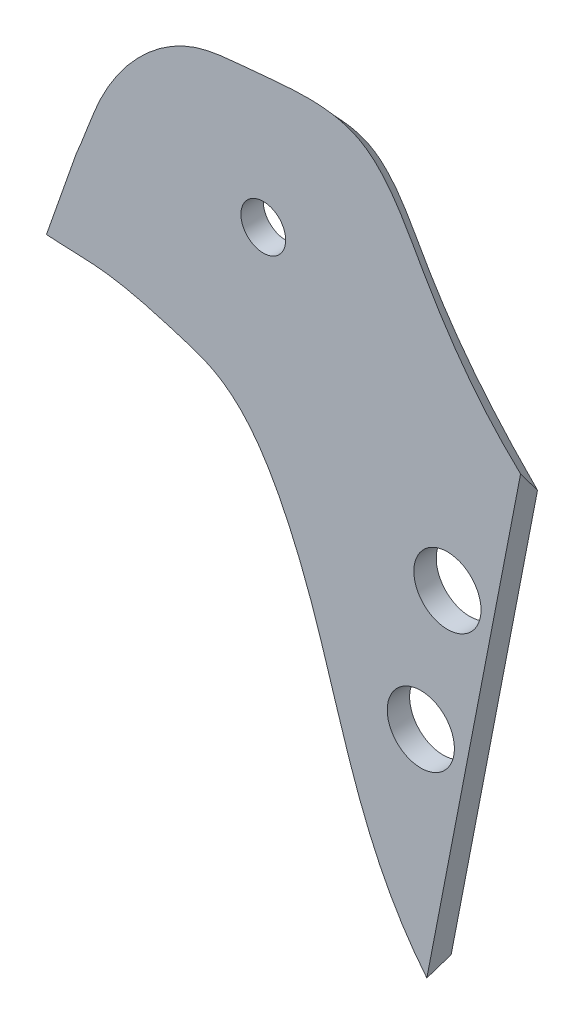
ISO-10303-21;
HEADER;
FILE_DESCRIPTION(('STEP AP214'),'2;1');
FILE_NAME('part.step','',(''),(''),'','','');
FILE_SCHEMA(('AUTOMOTIVE_DESIGN { 1 0 10303 214 1 1 1 1 }'));
ENDSEC;
DATA;
#1=APPLICATION_CONTEXT('core data for automotive mechanical design processes');
#2=APPLICATION_PROTOCOL_DEFINITION('international standard','automotive_design',2000,#1);
#3=PRODUCT_CONTEXT('',#1,'mechanical');
#4=PRODUCT('Part','Part','',(#3));
#5=PRODUCT_RELATED_PRODUCT_CATEGORY('part','',(#4));
#6=PRODUCT_DEFINITION_FORMATION('','',#4);
#7=PRODUCT_DEFINITION_CONTEXT('part definition',#1,'design');
#8=PRODUCT_DEFINITION('design','',#6,#7);
#9=PRODUCT_DEFINITION_SHAPE('','',#8);
#10=(LENGTH_UNIT() NAMED_UNIT(*) SI_UNIT(.MILLI.,.METRE.));
#11=(NAMED_UNIT(*) PLANE_ANGLE_UNIT() SI_UNIT($,.RADIAN.));
#12=(NAMED_UNIT(*) SI_UNIT($,.STERADIAN.) SOLID_ANGLE_UNIT());
#13=UNCERTAINTY_MEASURE_WITH_UNIT(LENGTH_MEASURE(1.E-05),#10,'distance_accuracy_value','');
#14=(GEOMETRIC_REPRESENTATION_CONTEXT(3) GLOBAL_UNCERTAINTY_ASSIGNED_CONTEXT((#13)) GLOBAL_UNIT_ASSIGNED_CONTEXT((#10,
#11,#12)) REPRESENTATION_CONTEXT('',''));
#15=CARTESIAN_POINT('',(0.,0.,0.));
#16=DIRECTION('',(0.,0.,1.));
#17=DIRECTION('',(1.,0.,0.));
#18=AXIS2_PLACEMENT_3D('',#15,#16,#17);
#19=CARTESIAN_POINT('',(0.,0.,16.01702912884));
#20=DIRECTION('',(0.,0.,-1.));
#21=DIRECTION('',(-1.,0.,0.));
#22=AXIS2_PLACEMENT_3D('',#19,#20,#21);
#23=PLANE('',#22);
#24=CARTESIAN_POINT('',(51.1823021652925,-0.288224536730692,16.01702912884));
#25=DIRECTION('',(0.,0.,-1.));
#26=DIRECTION('',(-1.,0.,0.));
#27=AXIS2_PLACEMENT_3D('',#24,#25,#26);
#28=CIRCLE('',#27,2.55);
#29=CARTESIAN_POINT('',(48.6323021652925,-0.288224536730692,16.01702912884));
#30=VERTEX_POINT('',#29);
#31=EDGE_CURVE('E217',#30,#30,#28,.F.);
#32=ORIENTED_EDGE('',*,*,#31,.F.);
#33=EDGE_LOOP('',(#32));
#34=FACE_BOUND('',#33,.T.);
#35=CARTESIAN_POINT('',(56.7374791845424,10.1611521460587,16.01702912884));
#36=CARTESIAN_POINT('',(53.6201790954461,13.0770034793296,16.01702912884));
#37=CARTESIAN_POINT('',(50.0180932993099,18.1127380968674,16.01702912884));
#38=CARTESIAN_POINT('',(45.1972513004322,27.6593441288069,16.01702912884));
#39=CARTESIAN_POINT('',(37.5823057666446,26.5396477813974,16.01702912884));
#40=CARTESIAN_POINT('',(30.2888783292712,26.1262149818505,16.01702912884));
#41=CARTESIAN_POINT('',(25.1507624600812,20.7991546822461,16.01702912884));
#42=CARTESIAN_POINT('',(23.7062806262853,15.9520347530322,16.01702912884));
#43=CARTESIAN_POINT('',(22.9879280203535,14.3317152162057,16.01702912884));
#44=B_SPLINE_CURVE_WITH_KNOTS('',3,(#35,#36,#37,#38,#39,#40,#41,#42,#43),.UNSPECIFIED.,.F.,.F.,
(4,1,1,1,1,1,4),(0.0984022232735256,0.332263847237948,0.478784406260262,0.635689441844704,
0.712428507943073,0.897170220945366,1.),.UNSPECIFIED.);
#45=CARTESIAN_POINT('',(56.7374791845424,10.1611521460587,16.01702912884));
#46=VERTEX_POINT('',#45);
#47=CARTESIAN_POINT('',(22.9879280203535,14.3317152162057,16.01702912884));
#48=VERTEX_POINT('',#47);
#49=EDGE_CURVE('E11',#46,#48,#44,.T.);
#50=ORIENTED_EDGE('',*,*,#49,.T.);
#51=DIRECTION('',(-0.330896267797108,-0.943667134088045,0.));
#52=VECTOR('',#51,1.);
#53=CARTESIAN_POINT('',(22.9879280203535,14.3317152162057,16.01702912884));
#54=LINE('',#53,#52);
#55=CARTESIAN_POINT('',(20.7358239624741,7.90904808817925,16.01702912884));
#56=VERTEX_POINT('',#55);
#57=EDGE_CURVE('E56',#48,#56,#54,.T.);
#58=ORIENTED_EDGE('',*,*,#57,.T.);
#59=CARTESIAN_POINT('',(49.6196669779243,-26.5463761324561,16.01702912884));
#60=CARTESIAN_POINT('',(43.2492805940054,-18.7500409121456,16.01702912884));
#61=CARTESIAN_POINT('',(42.939430023337,-9.06895658906215,16.01702912884));
#62=CARTESIAN_POINT('',(37.1332559765229,1.93741252860381,16.01702912884));
#63=CARTESIAN_POINT('',(35.2507090670857,4.55315707015074,16.01702912884));
#64=CARTESIAN_POINT('',(32.1310659942215,5.91401084382313,16.01702912884));
#65=CARTESIAN_POINT('',(30.4318693935687,6.42225490504846,16.01702912884));
#66=CARTESIAN_POINT('',(28.0514115307685,7.1211363639849,16.01702912884));
#67=CARTESIAN_POINT('',(25.7237718116332,7.64883772411055,16.01702912884));
#68=CARTESIAN_POINT('',(23.0704306063669,7.80734939259081,16.01702912884));
#69=CARTESIAN_POINT('',(21.6154249352378,7.83542911899976,16.01702912884));
#70=CARTESIAN_POINT('',(20.7358239624741,7.90904808817925,16.01702912884));
#71=B_SPLINE_CURVE_WITH_KNOTS('',3,(#59,#60,#61,#62,#63,#64,#65,#66,#67,#68,#69,#70),
.UNSPECIFIED.,.F.,.F.,(4,1,1,1,1,1,1,1,1,4),(0.,0.5753955187474,0.590281858038789,
0.73120017124348,0.761280417756446,0.79948376879211,0.83778666902761,0.91153847834065,
0.945817570362568,1.),.UNSPECIFIED.);
#72=CARTESIAN_POINT('',(49.6196669779243,-26.5463761324561,16.01702912884));
#73=VERTEX_POINT('',#72);
#74=EDGE_CURVE('E48',#56,#73,#71,.F.);
#75=ORIENTED_EDGE('',*,*,#74,.T.);
#76=DIRECTION('',(-0.190360349727867,-0.981714284938079,0.));
#77=VECTOR('',#76,1.);
#78=CARTESIAN_POINT('',(54.4053665233455,-1.86587090183388,16.01702912884));
#79=LINE('',#78,#77);
#80=EDGE_CURVE('E62',#46,#73,#79,.T.);
#81=ORIENTED_EDGE('',*,*,#80,.F.);
#82=EDGE_LOOP('',(#50,#58,#75,#81));
#83=FACE_BOUND('',#82,.T.);
#84=CARTESIAN_POINT('',(49.1635521652925,-10.4166543376605,16.01702912884));
#85=DIRECTION('',(0.,0.,-1.));
#86=DIRECTION('',(-1.,0.,0.));
#87=AXIS2_PLACEMENT_3D('',#84,#85,#86);
#88=CIRCLE('',#87,2.54999999999999);
#89=CARTESIAN_POINT('',(46.6135521652925,-10.4166543376605,16.01702912884));
#90=VERTEX_POINT('',#89);
#91=EDGE_CURVE('E102',#90,#90,#88,.F.);
#92=ORIENTED_EDGE('',*,*,#91,.F.);
#93=EDGE_LOOP('',(#92));
#94=FACE_BOUND('',#93,.T.);
#95=CARTESIAN_POINT('',(37.1997621715917,16.6182196540824,16.01702912884));
#96=DIRECTION('',(0.,0.,-1.));
#97=DIRECTION('',(-1.,0.,0.));
#98=AXIS2_PLACEMENT_3D('',#95,#96,#97);
#99=CIRCLE('',#98,1.7);
#100=CARTESIAN_POINT('',(35.4997621715917,16.6182196540824,16.01702912884));
#101=VERTEX_POINT('',#100);
#102=EDGE_CURVE('E203',#101,#101,#99,.F.);
#103=ORIENTED_EDGE('',*,*,#102,.F.);
#104=EDGE_LOOP('',(#103));
#105=FACE_BOUND('',#104,.T.);
#106=ADVANCED_FACE('F37',(#34,#83,#94,#105),#23,.F.);
#107=CARTESIAN_POINT('',(54.4053665233455,-1.86587090183388,9.68452912884005));
#108=DIRECTION('',(-0.981714284938079,0.190360349727867,0.));
#109=DIRECTION('',(-0.190360349727867,-0.981714284938079,0.));
#110=AXIS2_PLACEMENT_3D('',#107,#108,#109);
#111=PLANE('',#110);
#112=DIRECTION('',(0.149801028702046,0.772544334917706,0.617037196922818));
#113=VECTOR('',#112,1.);
#114=CARTESIAN_POINT('',(56.5311206780671,9.09693318494118,15.16702912884));
#115=LINE('',#114,#113);
#116=CARTESIAN_POINT('',(56.3247621715917,8.03271422382369,14.31702912884));
#117=VERTEX_POINT('',#116);
#118=EDGE_CURVE('E90',#117,#46,#115,.T.);
#119=ORIENTED_EDGE('',*,*,#118,.T.);
#120=ORIENTED_EDGE('',*,*,#80,.T.);
#121=DIRECTION('',(0.0787333022099367,0.40603837716383,-0.910458073385745));
#122=VECTOR('',#121,1.);
#123=CARTESIAN_POINT('',(49.6931720725956,-26.1673003345934,15.16702912884));
#124=LINE('',#123,#122);
#125=CARTESIAN_POINT('',(49.7666771672669,-25.7882245367307,14.31702912884));
#126=VERTEX_POINT('',#125);
#127=EDGE_CURVE('E111',#73,#126,#124,.T.);
#128=ORIENTED_EDGE('',*,*,#127,.T.);
#129=DIRECTION('',(0.190360349727867,0.981714284938079,0.));
#130=VECTOR('',#129,1.);
#131=CARTESIAN_POINT('',(49.7666771672668,-25.7882245367307,14.31702912884));
#132=LINE('',#131,#130);
#133=EDGE_CURVE('E110',#126,#117,#132,.T.);
#134=ORIENTED_EDGE('',*,*,#133,.T.);
#135=EDGE_LOOP('',(#119,#120,#128,#134));
#136=FACE_BOUND('',#135,.T.);
#137=ADVANCED_FACE('F274',(#136),#111,.F.);
#138=CARTESIAN_POINT('',(37.1997621715917,16.6182196540824,15.59202912884));
#139=DIRECTION('',(0.,0.,1.));
#140=DIRECTION('',(1.,0.,0.));
#141=AXIS2_PLACEMENT_3D('',#138,#139,#140);
#142=CYLINDRICAL_SURFACE('',#141,1.7);
#143=ORIENTED_EDGE('',*,*,#102,.T.);
#144=EDGE_LOOP('',(#143));
#145=FACE_BOUND('',#144,.T.);
#146=CARTESIAN_POINT('',(37.1997621715917,16.6182196540824,14.31702912884));
#147=DIRECTION('',(0.,0.,1.));
#148=DIRECTION('',(1.,0.,0.));
#149=AXIS2_PLACEMENT_3D('',#146,#147,#148);
#150=CIRCLE('',#149,1.7);
#151=CARTESIAN_POINT('',(38.8997621715917,16.6182196540824,14.31702912884));
#152=VERTEX_POINT('',#151);
#153=EDGE_CURVE('E248',#152,#152,#150,.T.);
#154=ORIENTED_EDGE('',*,*,#153,.F.);
#155=EDGE_LOOP('',(#154));
#156=FACE_BOUND('',#155,.T.);
#157=ADVANCED_FACE('F271',(#145,#156),#142,.F.);
#158=CARTESIAN_POINT('',(51.1823021652925,-0.288224536730692,4.55453996073724));
#159=DIRECTION('',(0.,0.,1.));
#160=DIRECTION('',(1.,0.,0.));
#161=AXIS2_PLACEMENT_3D('',#158,#159,#160);
#162=CYLINDRICAL_SURFACE('',#161,2.55);
#163=ORIENTED_EDGE('',*,*,#31,.T.);
#164=EDGE_LOOP('',(#163));
#165=FACE_BOUND('',#164,.T.);
#166=CARTESIAN_POINT('',(51.1823021652925,-0.288224536730692,14.31702912884));
#167=DIRECTION('',(0.,0.,1.));
#168=DIRECTION('',(1.,0.,0.));
#169=AXIS2_PLACEMENT_3D('',#166,#167,#168);
#170=CIRCLE('',#169,2.55);
#171=CARTESIAN_POINT('',(53.7323021652925,-0.288224536730692,14.31702912884));
#172=VERTEX_POINT('',#171);
#173=EDGE_CURVE('E251',#172,#172,#170,.T.);
#174=ORIENTED_EDGE('',*,*,#173,.F.);
#175=EDGE_LOOP('',(#174));
#176=FACE_BOUND('',#175,.T.);
#177=ADVANCED_FACE('F266',(#165,#176),#162,.F.);
#178=CARTESIAN_POINT('',(49.1635521652925,-10.4166543376605,4.55453996073728));
#179=DIRECTION('',(0.,0.,1.));
#180=DIRECTION('',(1.,0.,0.));
#181=AXIS2_PLACEMENT_3D('',#178,#179,#180);
#182=CYLINDRICAL_SURFACE('',#181,2.54999999999999);
#183=ORIENTED_EDGE('',*,*,#91,.T.);
#184=EDGE_LOOP('',(#183));
#185=FACE_BOUND('',#184,.T.);
#186=CARTESIAN_POINT('',(49.1635521652925,-10.4166543376605,14.31702912884));
#187=DIRECTION('',(0.,0.,1.));
#188=DIRECTION('',(1.,0.,0.));
#189=AXIS2_PLACEMENT_3D('',#186,#187,#188);
#190=CIRCLE('',#189,2.54999999999999);
#191=CARTESIAN_POINT('',(51.7135521652925,-10.4166543376605,14.31702912884));
#192=VERTEX_POINT('',#191);
#193=EDGE_CURVE('E256',#192,#192,#190,.T.);
#194=ORIENTED_EDGE('',*,*,#193,.F.);
#195=EDGE_LOOP('',(#194));
#196=FACE_BOUND('',#195,.T.);
#197=ADVANCED_FACE('F180',(#185,#196),#182,.F.);
#198=CARTESIAN_POINT('',(42.2011849808601,24.8148172093596,14.31702912884));
#199=DIRECTION('',(0.,0.,-1.));
#200=DIRECTION('',(1.,0.,0.));
#201=AXIS2_PLACEMENT_3D('',#198,#199,#200);
#202=PLANE('',#201);
#203=ORIENTED_EDGE('',*,*,#193,.T.);
#204=EDGE_LOOP('',(#203));
#205=FACE_BOUND('',#204,.T.);
#206=ORIENTED_EDGE('',*,*,#173,.T.);
#207=EDGE_LOOP('',(#206));
#208=FACE_BOUND('',#207,.T.);
#209=ORIENTED_EDGE('',*,*,#153,.T.);
#210=EDGE_LOOP('',(#209));
#211=FACE_BOUND('',#210,.T.);
#212=CARTESIAN_POINT('',(56.3247621715917,8.03271422382369,14.31702912884));
#213=CARTESIAN_POINT('',(52.8679076907351,11.496165528097,14.31702912884));
#214=CARTESIAN_POINT('',(48.8599680154124,16.3360273622185,14.31702912884));
#215=CARTESIAN_POINT('',(44.2241470254929,25.775486125325,14.31702912884));
#216=CARTESIAN_POINT('',(37.567466531524,24.6409319402532,14.31702912884));
#217=CARTESIAN_POINT('',(29.7072493366158,23.9216854788249,14.31702912884));
#218=CARTESIAN_POINT('',(25.7295651741228,18.0078595906483,14.31702912884));
#219=CARTESIAN_POINT('',(24.7497084623282,14.0682196540823,14.31702912884));
#220=B_SPLINE_CURVE_WITH_KNOTS('',3,(#212,#213,#214,#215,#216,#217,#218,#219),.UNSPECIFIED.,.F.,
.F.,(4,1,1,1,1,4),(0.,0.315366468989364,0.46461990204709,0.621804756140367,0.707276749613521,
1.),.UNSPECIFIED.);
#221=CARTESIAN_POINT('',(24.7497084623282,14.0682196540823,14.31702912884));
#222=VERTEX_POINT('',#221);
#223=EDGE_CURVE('E97',#117,#222,#220,.T.);
#224=ORIENTED_EDGE('',*,*,#223,.F.);
#225=ORIENTED_EDGE('',*,*,#133,.F.);
#226=CARTESIAN_POINT('',(23.0872300498878,9.14472589416278,14.31702912884));
#227=CARTESIAN_POINT('',(23.9071552614502,8.90389135487674,14.31702912884));
#228=CARTESIAN_POINT('',(26.4147155565695,8.40600553783021,14.31702912884));
#229=CARTESIAN_POINT('',(30.1574904202226,7.93532093414824,14.31702912884));
#230=CARTESIAN_POINT('',(35.409397744306,5.68865065157843,14.31702912884));
#231=CARTESIAN_POINT('',(43.4811194703326,-5.64116995348703,14.31702912884));
#232=CARTESIAN_POINT('',(43.5281504977051,-18.220731086188,14.31702912884));
#233=CARTESIAN_POINT('',(49.7666771672669,-25.7882245367307,14.31702912884));
#234=B_SPLINE_CURVE_WITH_KNOTS('',3,(#226,#227,#228,#229,#230,#231,#232,#233),.UNSPECIFIED.,.F.,
.F.,(4,1,1,1,1,4),(0.,0.0541824296374315,0.16221333097239,0.238719582243554,0.409718141961211,
1.),.UNSPECIFIED.);
#235=CARTESIAN_POINT('',(23.0872300498878,9.14472589416278,14.31702912884));
#236=VERTEX_POINT('',#235);
#237=EDGE_CURVE('E100',#236,#126,#234,.T.);
#238=ORIENTED_EDGE('',*,*,#237,.F.);
#239=DIRECTION('',(-0.319916718913096,-0.947445667550324,0.));
#240=VECTOR('',#239,1.);
#241=CARTESIAN_POINT('',(24.7497084623282,14.0682196540823,14.31702912884));
#242=LINE('',#241,#240);
#243=EDGE_CURVE('E84',#222,#236,#242,.T.);
#244=ORIENTED_EDGE('',*,*,#243,.F.);
#245=EDGE_LOOP('',(#224,#225,#238,#244));
#246=FACE_BOUND('',#245,.T.);
#247=ADVANCED_FACE('F95',(#205,#208,#211,#246),#202,.T.);
#248=CARTESIAN_POINT('',(56.7374791845424,10.1611521460587,16.01702912884));
#249=CARTESIAN_POINT('',(56.3247621715917,8.03271422382369,14.31702912884));
#250=CARTESIAN_POINT('',(53.6201790954461,13.0770034793296,16.01702912884));
#251=CARTESIAN_POINT('',(53.4815340141107,10.8813682024356,14.31702912884));
#252=CARTESIAN_POINT('',(50.9276386605399,16.8411889664497,16.01702912884));
#253=CARTESIAN_POINT('',(50.6303744477103,14.1981402639373,14.31702912884));
#254=CARTESIAN_POINT('',(47.4668919484403,23.1648253070632,16.01702912884));
#255=CARTESIAN_POINT('',(47.2667425586454,19.7150457705081,14.31702912884));
#256=CARTESIAN_POINT('',(45.4662591057677,25.8150722220901,16.01702912884));
#257=CARTESIAN_POINT('',(45.7145385390748,22.7407509049763,14.31702912884));
#258=CARTESIAN_POINT('',(41.4908067982299,27.1143510815713,16.01702912884));
#259=CARTESIAN_POINT('',(42.6933411886686,25.2368619241954,14.31702912884));
#260=CARTESIAN_POINT('',(37.9577758668488,26.6416571868208,16.01702912884));
#261=CARTESIAN_POINT('',(39.4587516791819,24.9632796151015,14.31702912884));
#262=CARTESIAN_POINT('',(34.4403844972373,26.3615458783455,16.01702912884));
#263=CARTESIAN_POINT('',(36.052554326043,24.5184502229449,14.31702912884));
#264=CARTESIAN_POINT('',(32.7201382629059,26.1402152904171,16.01702912884));
#265=CARTESIAN_POINT('',(34.3900462403712,24.3501831932131,14.31702912884));
#266=CARTESIAN_POINT('',(28.8729837341728,24.6582535582475,16.01702912884));
#267=CARTESIAN_POINT('',(30.6843016318662,23.4039560479854,14.31702912884));
#268=CARTESIAN_POINT('',(25.0319533013774,20.400477296728,16.01702912884));
#269=CARTESIAN_POINT('',(26.9291205566539,19.7912997497251,14.31702912884));
#270=CARTESIAN_POINT('',(23.7062806262853,15.9520347530322,16.01702912884));
#271=CARTESIAN_POINT('',(25.1314869237919,15.6032090618174,14.31702912884));
#272=CARTESIAN_POINT('',(22.9879280203535,14.3317152162057,16.01702912884));
#273=CARTESIAN_POINT('',(24.7497084623282,14.0682196540823,14.31702912884));
#274=B_SPLINE_SURFACE_WITH_KNOTS('',3,1,((#248,#249),(#250,#251),(#252,#253),(#254,#255),(#256,
#257),(#258,#259),(#260,#261),(#262,#263),(#264,#265),(#266,#267),(#268,#269),(#270,#271),(#272,
#273)),.UNSPECIFIED.,.F.,.F.,.F.,(4,1,1,1,1,1,1,1,1,1,4),(2,2),(0.,0.259385759372132,
0.315366468989364,0.421897871540711,0.46461990204709,0.595927843258402,0.621804756140367,
0.681042367805029,0.707276749613521,0.88594716878297,1.),(0.,1.),.UNSPECIFIED.);
#275=DIRECTION('',(0.715479586900087,-0.107008621191608,-0.69038982880685));
#276=VECTOR('',#275,1.);
#277=CARTESIAN_POINT('',(23.8688182413409,14.199967435144,15.16702912884));
#278=LINE('',#277,#276);
#279=EDGE_CURVE('E81',#48,#222,#278,.T.);
#280=ORIENTED_EDGE('',*,*,#49,.F.);
#281=ORIENTED_EDGE('',*,*,#118,.F.);
#282=ORIENTED_EDGE('',*,*,#223,.T.);
#283=ORIENTED_EDGE('',*,*,#279,.F.);
#284=EDGE_LOOP('',(#280,#281,#282,#283));
#285=FACE_BOUND('',#284,.T.);
#286=ADVANCED_FACE('F107',(#285),#274,.F.);
#287=CARTESIAN_POINT('',(22.9879280203535,14.3317152162057,16.01702912884));
#288=CARTESIAN_POINT('',(24.7497084623282,14.0682196540823,14.31702912884));
#289=CARTESIAN_POINT('',(22.6125773440403,13.261270694868,16.01702912884));
#290=CARTESIAN_POINT('',(24.4726287269215,13.2476373607624,14.31702912884));
#291=CARTESIAN_POINT('',(22.2372266677271,12.1908261735302,16.01702912884));
#292=CARTESIAN_POINT('',(24.1955489915148,12.4270550674425,14.31702912884));
#293=CARTESIAN_POINT('',(21.4865253151006,10.0499371308547,16.01702912884));
#294=CARTESIAN_POINT('',(23.6413895207013,10.7858904808026,14.31702912884));
#295=CARTESIAN_POINT('',(21.1111746387874,8.97949260951699,16.01702912884));
#296=CARTESIAN_POINT('',(23.3643097852946,9.96530818748272,14.31702912884));
#297=CARTESIAN_POINT('',(20.7358239624741,7.90904808817925,16.01702912884));
#298=CARTESIAN_POINT('',(23.0872300498878,9.14472589416278,14.31702912884));
#299=B_SPLINE_SURFACE_WITH_KNOTS('',3,1,((#287,#288),(#289,#290),(#291,#292),(#293,#294),(#295,
#296),(#297,#298)),.UNSPECIFIED.,.F.,.F.,.F.,(4,2,4),(2,2),(0.,0.5,1.),(0.,1.),.UNSPECIFIED.);
#300=DIRECTION('',(0.745595344172381,0.391814763077272,-0.539044315602316));
#301=VECTOR('',#300,1.);
#302=CARTESIAN_POINT('',(21.911527006181,8.52688699117102,15.16702912884));
#303=LINE('',#302,#301);
#304=EDGE_CURVE('E89',#56,#236,#303,.T.);
#305=ORIENTED_EDGE('',*,*,#57,.F.);
#306=ORIENTED_EDGE('',*,*,#279,.T.);
#307=ORIENTED_EDGE('',*,*,#243,.T.);
#308=ORIENTED_EDGE('',*,*,#304,.F.);
#309=EDGE_LOOP('',(#305,#306,#307,#308));
#310=FACE_BOUND('',#309,.T.);
#311=ADVANCED_FACE('F83',(#310),#299,.F.);
#312=CARTESIAN_POINT('',(20.7358239624741,7.90904808817925,16.01702912884));
#313=CARTESIAN_POINT('',(23.0872300498878,9.14472589416278,14.31702912884));
#314=CARTESIAN_POINT('',(21.6154249352378,7.83542911899976,16.01702912884));
#315=CARTESIAN_POINT('',(23.9071552614502,8.90389135487674,14.31702912884));
#316=CARTESIAN_POINT('',(23.0704306063669,7.80734939259081,16.01702912884));
#317=CARTESIAN_POINT('',(25.2746297965522,8.63237398497549,14.31702912884));
#318=CARTESIAN_POINT('',(25.7237718116332,7.64883772411055,16.01702912884));
#319=CARTESIAN_POINT('',(27.8016631900876,8.23158550964478,14.31702912884));
#320=CARTESIAN_POINT('',(28.0514115307685,7.1211363639849,16.01702912884));
#321=CARTESIAN_POINT('',(30.0713165943711,7.82488479816171,14.31702912884));
#322=CARTESIAN_POINT('',(30.4318693935687,6.42225490504846,16.01702912884));
#323=CARTESIAN_POINT('',(32.3191060824179,7.01062113064603,14.31702912884));
#324=CARTESIAN_POINT('',(32.1310659942215,5.91401084382313,16.01702912884));
#325=CARTESIAN_POINT('',(33.808843698735,6.21825298874981,14.31702912884));
#326=CARTESIAN_POINT('',(35.2507090670857,4.55315707015074,16.01702912884));
#327=CARTESIAN_POINT('',(36.4363137620361,4.24722654749472,14.31702912884));
#328=CARTESIAN_POINT('',(37.1332559765229,1.93741252860381,16.01702912884));
#329=CARTESIAN_POINT('',(38.1569260374253,1.71136973947847,14.31702912884));
#330=CARTESIAN_POINT('',(42.939430023337,-9.06895658906215,16.01702912884));
#331=CARTESIAN_POINT('',(43.4926032252927,-8.71277194953148,14.31702912884));
#332=CARTESIAN_POINT('',(43.2492805940054,-18.7500409121456,16.01702912884));
#333=CARTESIAN_POINT('',(43.6854801249277,-18.4115759741953,14.31702912884));
#334=CARTESIAN_POINT('',(49.6196669779243,-26.5463761324561,16.01702912884));
#335=CARTESIAN_POINT('',(49.7666771672669,-25.7882245367307,14.31702912884));
#336=B_SPLINE_SURFACE_WITH_KNOTS('',3,1,((#312,#313),(#314,#315),(#316,#317),(#318,#319),(#320,
#321),(#322,#323),(#324,#325),(#326,#327),(#328,#329),(#330,#331),(#332,#333),(#334,#335)),
.UNSPECIFIED.,.F.,.F.,.F.,(4,1,1,1,1,1,1,1,1,4),(2,2),(0.,0.0541824296374315,0.0884615216593502,
0.16221333097239,0.20051623120789,0.238719582243554,0.26879982875652,0.409718141961211,
0.4246044812526,1.),(0.,1.),.UNSPECIFIED.);
#337=ORIENTED_EDGE('',*,*,#74,.F.);
#338=ORIENTED_EDGE('',*,*,#304,.T.);
#339=ORIENTED_EDGE('',*,*,#237,.T.);
#340=ORIENTED_EDGE('',*,*,#127,.F.);
#341=EDGE_LOOP('',(#337,#338,#339,#340));
#342=FACE_BOUND('',#341,.T.);
#343=ADVANCED_FACE('F139',(#342),#336,.F.);
#344=CLOSED_SHELL('',(#106,#137,#157,#177,#197,#247,#286,#311,#343));
#345=MANIFOLD_SOLID_BREP('B2',#344);
#346=ADVANCED_BREP_SHAPE_REPRESENTATION('',(#18,#345),#14);
#347=SHAPE_DEFINITION_REPRESENTATION(#9,#346);
ENDSEC;
END-ISO-10303-21;
